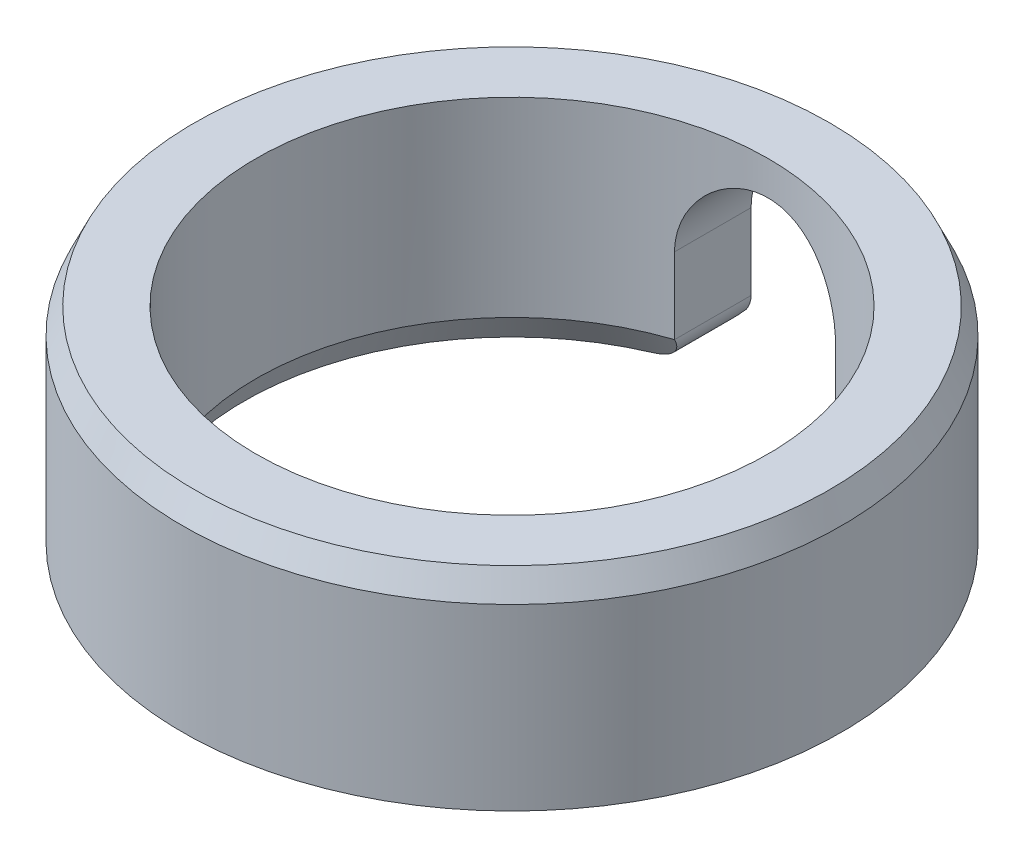
ISO-10303-21;
HEADER;
FILE_DESCRIPTION(('STEP AP214'),'2;1');
FILE_NAME('part.step','',(''),(''),'','','');
FILE_SCHEMA(('AUTOMOTIVE_DESIGN { 1 0 10303 214 1 1 1 1 }'));
ENDSEC;
DATA;
#1=APPLICATION_CONTEXT('core data for automotive mechanical design processes');
#2=APPLICATION_PROTOCOL_DEFINITION('international standard','automotive_design',2000,#1);
#3=PRODUCT_CONTEXT('',#1,'mechanical');
#4=PRODUCT('Part','Part','',(#3));
#5=PRODUCT_RELATED_PRODUCT_CATEGORY('part','',(#4));
#6=PRODUCT_DEFINITION_FORMATION('','',#4);
#7=PRODUCT_DEFINITION_CONTEXT('part definition',#1,'design');
#8=PRODUCT_DEFINITION('design','',#6,#7);
#9=PRODUCT_DEFINITION_SHAPE('','',#8);
#10=(LENGTH_UNIT() NAMED_UNIT(*) SI_UNIT(.MILLI.,.METRE.));
#11=(NAMED_UNIT(*) PLANE_ANGLE_UNIT() SI_UNIT($,.RADIAN.));
#12=(NAMED_UNIT(*) SI_UNIT($,.STERADIAN.) SOLID_ANGLE_UNIT());
#13=UNCERTAINTY_MEASURE_WITH_UNIT(LENGTH_MEASURE(1.E-05),#10,'distance_accuracy_value','');
#14=(GEOMETRIC_REPRESENTATION_CONTEXT(3) GLOBAL_UNCERTAINTY_ASSIGNED_CONTEXT((#13)) GLOBAL_UNIT_ASSIGNED_CONTEXT((#10,
#11,#12)) REPRESENTATION_CONTEXT('',''));
#15=CARTESIAN_POINT('',(0.,0.,0.));
#16=DIRECTION('',(0.,0.,1.));
#17=DIRECTION('',(1.,0.,0.));
#18=AXIS2_PLACEMENT_3D('',#15,#16,#17);
#19=CARTESIAN_POINT('',(0.,0.,0.));
#20=DIRECTION('',(0.,1.,0.));
#21=DIRECTION('',(0.,0.,-1.));
#22=AXIS2_PLACEMENT_3D('',#19,#20,#21);
#23=PLANE('',#22);
#24=CARTESIAN_POINT('',(0.,0.,0.));
#25=DIRECTION('',(0.,-1.,0.));
#26=DIRECTION('',(0.,0.,-1.));
#27=AXIS2_PLACEMENT_3D('',#24,#25,#26);
#28=CIRCLE('',#27,12.);
#29=CARTESIAN_POINT('',(-4.175,0.,-11.2503055514061));
#30=VERTEX_POINT('',#29);
#31=CARTESIAN_POINT('',(4.175,0.,-11.2503055514061));
#32=VERTEX_POINT('',#31);
#33=EDGE_CURVE('E203',#30,#32,#28,.F.);
#34=ORIENTED_EDGE('',*,*,#33,.F.);
#35=DIRECTION('',(0.,0.,1.));
#36=VECTOR('',#35,1.);
#37=CARTESIAN_POINT('',(-4.175,0.,-11.5723539092096));
#38=LINE('',#37,#36);
#39=CARTESIAN_POINT('',(-4.175,0.,-9.70650465032521));
#40=VERTEX_POINT('',#39);
#41=EDGE_CURVE('E205',#40,#30,#38,.F.);
#42=ORIENTED_EDGE('',*,*,#41,.F.);
#43=CARTESIAN_POINT('',(0.,0.,0.));
#44=DIRECTION('',(0.,-1.,0.));
#45=DIRECTION('',(0.,0.,-1.));
#46=AXIS2_PLACEMENT_3D('',#43,#44,#45);
#47=CIRCLE('',#46,10.566307658155);
#48=CARTESIAN_POINT('',(4.175,0.,-9.70650465032521));
#49=VERTEX_POINT('',#48);
#50=EDGE_CURVE('E208',#49,#40,#47,.T.);
#51=ORIENTED_EDGE('',*,*,#50,.F.);
#52=DIRECTION('',(0.,0.,1.));
#53=VECTOR('',#52,1.);
#54=CARTESIAN_POINT('',(4.175,0.,-10.0780073688594));
#55=LINE('',#54,#53);
#56=EDGE_CURVE('E207',#32,#49,#55,.T.);
#57=ORIENTED_EDGE('',*,*,#56,.F.);
#58=EDGE_LOOP('',(#34,#42,#51,#57));
#59=FACE_BOUND('',#58,.T.);
#60=ADVANCED_FACE('F39',(#59),#23,.F.);
#61=CARTESIAN_POINT('',(0.,8.5222,0.));
#62=DIRECTION('',(0.,-1.,0.));
#63=DIRECTION('',(0.,0.,1.));
#64=AXIS2_PLACEMENT_3D('',#61,#62,#63);
#65=CYLINDRICAL_SURFACE('',#64,13.);
#66=CARTESIAN_POINT('',(0.,7.52219999999998,0.));
#67=DIRECTION('',(0.,-1.,0.));
#68=DIRECTION('',(0.,0.,-1.));
#69=AXIS2_PLACEMENT_3D('',#66,#67,#68);
#70=CIRCLE('',#69,13.);
#71=CARTESIAN_POINT('',(0.,7.52219999999998,-13.));
#72=VERTEX_POINT('',#71);
#73=EDGE_CURVE('E220',#72,#72,#70,.F.);
#74=ORIENTED_EDGE('',*,*,#73,.F.);
#75=EDGE_LOOP('',(#74));
#76=FACE_BOUND('',#75,.T.);
#77=DIRECTION('',(0.,-1.,0.));
#78=VECTOR('',#77,1.);
#79=CARTESIAN_POINT('',(3.175,8.5222,-12.6063228183321));
#80=LINE('',#79,#78);
#81=CARTESIAN_POINT('',(3.175,1.,-12.6063228183321));
#82=VERTEX_POINT('',#81);
#83=CARTESIAN_POINT('',(3.175,4.,-12.6063228183321));
#84=VERTEX_POINT('',#83);
#85=EDGE_CURVE('E118',#82,#84,#80,.F.);
#86=ORIENTED_EDGE('',*,*,#85,.T.);
#87=CARTESIAN_POINT('',(3.175,4.,-12.6063228183321));
#88=CARTESIAN_POINT('',(3.17501009851098,4.08787378597044,-12.6063132651038));
#89=CARTESIAN_POINT('',(3.17135205246371,4.17574163314016,-12.6072414061624));
#90=CARTESIAN_POINT('',(3.15677809224827,4.35082163667164,-12.6109022385434));
#91=CARTESIAN_POINT('',(3.14586335778261,4.43803389728038,-12.6136346365515));
#92=CARTESIAN_POINT('',(3.11688221350419,4.61102183710995,-12.6208262840811));
#93=CARTESIAN_POINT('',(3.09882956040884,4.69679995081072,-12.6252822115338));
#94=CARTESIAN_POINT('',(3.05573924696344,4.86646035879583,-12.6357803710173));
#95=CARTESIAN_POINT('',(3.0307014992745,4.95034262936113,-12.6418226228829));
#96=CARTESIAN_POINT('',(2.94538203174719,5.19825788694416,-12.6620768224457));
#97=CARTESIAN_POINT('',(2.87486550593256,5.35872839791942,-12.6784237603703));
#98=CARTESIAN_POINT('',(2.70871790710507,5.66552296377543,-12.7149532550345));
#99=CARTESIAN_POINT('',(2.61308061908652,5.81184350560743,-12.7351367606187));
#100=CARTESIAN_POINT('',(2.39725547071148,6.08931557258449,-12.7775372544766));
#101=CARTESIAN_POINT('',(2.2766401517653,6.22013049083328,-12.7997853209167));
#102=CARTESIAN_POINT('',(2.01520014546072,6.45989161030491,-12.8435394802179));
#103=CARTESIAN_POINT('',(1.87437224902378,6.56883433235655,-12.8650454545859));
#104=CARTESIAN_POINT('',(1.57419315491871,6.76313546468767,-12.9052358723955));
#105=CARTESIAN_POINT('',(1.41462099510097,6.84816180457834,-12.9238790969982));
#106=CARTESIAN_POINT('',(1.08292663079487,6.99005332171802,-12.9558862783522));
#107=CARTESIAN_POINT('',(0.910806824940755,7.04692386517736,-12.9692512409886));
#108=CARTESIAN_POINT('',(0.562432144797513,7.12981307329099,-12.9889763366451));
#109=CARTESIAN_POINT('',(0.386321836070524,7.15640771066527,-12.9954670729382));
#110=CARTESIAN_POINT('',(0.0320237903202308,7.17979674776153,-13.001167073455));
#111=CARTESIAN_POINT('',(-0.146163696822422,7.17659469576418,-13.0003772046755));
#112=CARTESIAN_POINT('',(-0.495559824196341,7.14089726494223,-12.9917024330288));
#113=CARTESIAN_POINT('',(-0.66683633645111,7.10902408502989,-12.9839682372075));
#114=CARTESIAN_POINT('',(-1.00153097298404,7.01788790399895,-12.9624486739077));
#115=CARTESIAN_POINT('',(-1.16494875857107,6.95862372356376,-12.9486630458867));
#116=CARTESIAN_POINT('',(-1.48094705402903,6.81387467110486,-12.9163565307896));
#117=CARTESIAN_POINT('',(-1.63342041224417,6.72816524782373,-12.8977953267573));
#118=CARTESIAN_POINT('',(-1.92203607368809,6.53313014203601,-12.8579560541876));
#119=CARTESIAN_POINT('',(-2.05817604688336,6.42380109629582,-12.8366775989132));
#120=CARTESIAN_POINT('',(-2.3139591897748,6.18129971086971,-12.7930794362632));
#121=CARTESIAN_POINT('',(-2.43308733710246,6.04758592906107,-12.7707470254997));
#122=CARTESIAN_POINT('',(-2.64736905217607,5.76180547562919,-12.7280561405833));
#123=CARTESIAN_POINT('',(-2.74251606792799,5.60973380511136,-12.7076982068187));
#124=CARTESIAN_POINT('',(-2.90645104355116,5.29055437412133,-12.6712137286851));
#125=CARTESIAN_POINT('',(-2.97510532370128,5.12337547964163,-12.6551087699541));
#126=CARTESIAN_POINT('',(-3.08308837814951,4.77946170261939,-12.6292399245633));
#127=CARTESIAN_POINT('',(-3.12246093942907,4.60274151404603,-12.6194665726462));
#128=CARTESIAN_POINT('',(-3.15603300411806,4.3537543037499,-12.6110871362746));
#129=CARTESIAN_POINT('',(-3.16314703165299,4.28314345543998,-12.6093031675515));
#130=CARTESIAN_POINT('',(-3.17262509936245,4.14169952347456,-12.6069215996323));
#131=CARTESIAN_POINT('',(-3.17499687265751,4.07086699058227,-12.6063220690103));
#132=CARTESIAN_POINT('',(-3.175,4.,-12.6063228183321));
#133=B_SPLINE_CURVE_WITH_KNOTS('',3,(#87,#88,#89,#90,#91,#92,#93,#94,#95,#96,#97,#98,#99,#100,
#101,#102,#103,#104,#105,#106,#107,#108,#109,#110,#111,#112,#113,#114,#115,#116,#117,#118,#119,
#120,#121,#122,#123,#124,#125,#126,#127,#128,#129,#130,#131,#132),.UNSPECIFIED.,.F.,.F.,(4,2,2,
2,2,2,2,2,2,2,2,2,2,2,2,2,2,2,2,2,2,2,4),(0.,0.263530091183203,0.527017351380499,
0.789999255766269,1.05298444852231,1.57844638130477,2.10403843871948,2.63950435018495,
3.17505536988955,3.71771158457418,4.26026433461408,4.79231333969312,5.32429898756418,
5.84501121703347,6.36574586780086,6.8910298674039,7.41638871234221,7.95527466181701,
8.49430768356239,9.03602611501808,9.57693283955251,9.78977044600888,10.0022606974916),.UNSPECIFIED.);
#134=CARTESIAN_POINT('',(-3.175,4.,-12.6063228183321));
#135=VERTEX_POINT('',#134);
#136=EDGE_CURVE('E102',#84,#135,#133,.T.);
#137=ORIENTED_EDGE('',*,*,#136,.T.);
#138=DIRECTION('',(0.,-1.,0.));
#139=VECTOR('',#138,1.);
#140=CARTESIAN_POINT('',(-3.175,8.5222,-12.6063228183321));
#141=LINE('',#140,#139);
#142=CARTESIAN_POINT('',(-3.175,1.,-12.6063228183321));
#143=VERTEX_POINT('',#142);
#144=EDGE_CURVE('E110',#135,#143,#141,.T.);
#145=ORIENTED_EDGE('',*,*,#144,.T.);
#146=CARTESIAN_POINT('',(-3.32932128780724,0.466307658155002,-12.5664481760979));
#147=CARTESIAN_POINT('',(-3.3146339147258,0.489581659288447,-12.5703391937686));
#148=CARTESIAN_POINT('',(-3.30089432935479,0.513483028317116,-12.5739520155139));
#149=CARTESIAN_POINT('',(-3.27540392853389,0.562405435888356,-12.5806161824473));
#150=CARTESIAN_POINT('',(-3.26365356886449,0.587426729377128,-12.5836673989718));
#151=CARTESIAN_POINT('',(-3.23206671790876,0.662686016902155,-12.5918312691069));
#152=CARTESIAN_POINT('',(-3.2151587310711,0.714289331923373,-12.5961470879905));
#153=CARTESIAN_POINT('',(-3.19348463363715,0.804705918081518,-12.6016564351079));
#154=CARTESIAN_POINT('',(-3.18663700431524,0.843009026171563,-12.6033877929176));
#155=CARTESIAN_POINT('',(-3.17735131405145,0.920859328719894,-12.6057306401717));
#156=CARTESIAN_POINT('',(-3.17499236067866,0.960416567577988,-12.6063220415455));
#157=CARTESIAN_POINT('',(-3.175,1.,-12.6063228183321));
#158=B_SPLINE_CURVE_WITH_KNOTS('',3,(#146,#147,#148,#149,#150,#151,#152,#153,#154,#155,#156,
#157),.UNSPECIFIED.,.F.,.F.,(4,2,2,2,2,4),(0.,0.083329666978949,0.166678401066295,
0.329241375331635,0.44582986509137,0.564454717051472),.UNSPECIFIED.);
#159=CARTESIAN_POINT('',(-3.32932128780724,0.466307658155002,-12.5664481760979));
#160=VERTEX_POINT('',#159);
#161=EDGE_CURVE('E147',#160,#143,#158,.T.);
#162=ORIENTED_EDGE('',*,*,#161,.F.);
#163=CARTESIAN_POINT('',(0.,0.466307658155002,0.));
#164=DIRECTION('',(0.,-1.,0.));
#165=DIRECTION('',(0.,0.,-1.));
#166=AXIS2_PLACEMENT_3D('',#163,#164,#165);
#167=CIRCLE('',#166,13.);
#168=CARTESIAN_POINT('',(3.32932128780724,0.466307658155002,-12.5664481760979));
#169=VERTEX_POINT('',#168);
#170=EDGE_CURVE('E223',#169,#160,#167,.T.);
#171=ORIENTED_EDGE('',*,*,#170,.F.);
#172=CARTESIAN_POINT('',(3.175,1.,-12.6063228183321));
#173=CARTESIAN_POINT('',(3.17500023984745,0.972207944779752,-12.6063221924203));
#174=CARTESIAN_POINT('',(3.17615952654659,0.944431586658988,-12.6060308357941));
#175=CARTESIAN_POINT('',(3.18078206207391,0.889080668877479,-12.604865491831));
#176=CARTESIAN_POINT('',(3.18424555028913,0.861506130485058,-12.6039914439573));
#177=CARTESIAN_POINT('',(3.19784301795716,0.78070290364726,-12.6005512176184));
#178=CARTESIAN_POINT('',(3.21118821717571,0.728004388055886,-12.5971663252682));
#179=CARTESIAN_POINT('',(3.24117892568194,0.64015772501383,-12.5894766939692));
#180=CARTESIAN_POINT('',(3.25582690792811,0.604257448940297,-12.5857019888294));
#181=CARTESIAN_POINT('',(3.28939991579291,0.533887391529717,-12.5769688879727));
#182=CARTESIAN_POINT('',(3.30839504268942,0.499453452204882,-12.5719910065933));
#183=CARTESIAN_POINT('',(3.32932128780724,0.466307658155002,-12.5664481760979));
#184=B_SPLINE_CURVE_WITH_KNOTS('',3,(#172,#173,#174,#175,#176,#177,#178,#179,#180,#181,#182,
#183),.UNSPECIFIED.,.F.,.F.,(4,2,2,2,2,4),(0.,0.0833193461441916,0.166647349815072,
0.329185528440588,0.445804285504046,0.564455786169551),.UNSPECIFIED.);
#185=EDGE_CURVE('E153',#82,#169,#184,.T.);
#186=ORIENTED_EDGE('',*,*,#185,.F.);
#187=EDGE_LOOP('',(#86,#137,#145,#162,#171,#186));
#188=FACE_BOUND('',#187,.T.);
#189=ADVANCED_FACE('F115',(#76,#188),#65,.T.);
#190=CARTESIAN_POINT('',(0.,8.5222,0.));
#191=DIRECTION('',(0.,-1.,0.));
#192=DIRECTION('',(0.,0.,1.));
#193=AXIS2_PLACEMENT_3D('',#190,#191,#192);
#194=CYLINDRICAL_SURFACE('',#193,10.1);
#195=CARTESIAN_POINT('',(0.,8.5222,0.));
#196=DIRECTION('',(0.,-1.,0.));
#197=DIRECTION('',(0.,0.,-1.));
#198=AXIS2_PLACEMENT_3D('',#195,#196,#197);
#199=CIRCLE('',#198,10.1);
#200=CARTESIAN_POINT('',(0.,8.5222,-10.1));
#201=VERTEX_POINT('',#200);
#202=EDGE_CURVE('E120',#201,#201,#199,.T.);
#203=ORIENTED_EDGE('',*,*,#202,.F.);
#204=EDGE_LOOP('',(#203));
#205=FACE_BOUND('',#204,.T.);
#206=DIRECTION('',(0.,-1.,0.));
#207=VECTOR('',#206,1.);
#208=CARTESIAN_POINT('',(-3.175,8.5222,-9.58798075717719));
#209=LINE('',#208,#207);
#210=CARTESIAN_POINT('',(-3.175,4.,-9.58798075717719));
#211=VERTEX_POINT('',#210);
#212=CARTESIAN_POINT('',(-3.175,1.00000000000001,-9.58798075717719));
#213=VERTEX_POINT('',#212);
#214=EDGE_CURVE('E241',#211,#213,#209,.T.);
#215=ORIENTED_EDGE('',*,*,#214,.F.);
#216=CARTESIAN_POINT('',(3.175,4.,-9.58798075717719));
#217=CARTESIAN_POINT('',(3.17501110403846,4.08692347838906,-9.58796790786724));
#218=CARTESIAN_POINT('',(3.17143060657522,4.17383967538083,-9.58916251621892));
#219=CARTESIAN_POINT('',(3.15717284476817,4.34700422154223,-9.5938710908655));
#220=CARTESIAN_POINT('',(3.14649730839338,4.43325272815239,-9.59738449242591));
#221=CARTESIAN_POINT('',(3.11817420570668,4.60423985769642,-9.6066226645862));
#222=CARTESIAN_POINT('',(3.10054558646608,4.68898193521027,-9.61234142467388));
#223=CARTESIAN_POINT('',(3.05849249682685,4.8565761805437,-9.62580427323813));
#224=CARTESIAN_POINT('',(3.03406782069659,4.93942829106765,-9.63354842302729));
#225=CARTESIAN_POINT('',(2.95090981681227,5.18422100488252,-9.65947949565651));
#226=CARTESIAN_POINT('',(2.88225359091744,5.3426302969105,-9.68037855294418));
#227=CARTESIAN_POINT('',(2.72064109945418,5.64569216879029,-9.72703165664799));
#228=CARTESIAN_POINT('',(2.62767200972875,5.79033743353579,-9.75278826324065));
#229=CARTESIAN_POINT('',(2.4166165716316,6.06682215665654,-9.80725167648352));
#230=CARTESIAN_POINT('',(2.29783454248537,6.19811841550925,-9.83602563189224));
#231=CARTESIAN_POINT('',(2.04001349194838,6.43929190011796,-9.89271164234553));
#232=CARTESIAN_POINT('',(1.900970982496,6.54916543008779,-9.92062354797402));
#233=CARTESIAN_POINT('',(1.60263746566888,6.74679940664522,-9.97321313387937));
#234=CARTESIAN_POINT('',(1.44295542775338,6.83399534559063,-9.99780203011461));
#235=CARTESIAN_POINT('',(1.11029445485004,6.98007509157532,-10.0401847718689));
#236=CARTESIAN_POINT('',(0.937319227682667,7.03896676041487,-10.0579805039758));
#237=CARTESIAN_POINT('',(0.588704828610891,7.12494295664201,-10.0842954772797));
#238=CARTESIAN_POINT('',(0.41331721675818,7.1529626730543,-10.0930868607303));
#239=CARTESIAN_POINT('',(0.0601209450263003,7.17936362250599,-10.101364266219));
#240=CARTESIAN_POINT('',(-0.117687199257961,7.17775107174336,-10.1008522399082));
#241=CARTESIAN_POINT('',(-0.464085359933637,7.14554536770283,-10.0907691973101));
#242=CARTESIAN_POINT('',(-0.63278040055622,7.11596665944189,-10.0815152941289));
#243=CARTESIAN_POINT('',(-0.962675979439209,7.03033458117567,-10.0553791770672));
#244=CARTESIAN_POINT('',(-1.12387611290808,6.97427978304667,-10.0384965516945));
#245=CARTESIAN_POINT('',(-1.43653957134369,6.83663891109923,-9.99857598515466));
#246=CARTESIAN_POINT('',(-1.58785826282529,6.75474643258653,-9.97546468564356));
#247=CARTESIAN_POINT('',(-1.8749181551735,6.5680046876658,-9.92551969960479));
#248=CARTESIAN_POINT('',(-2.01065552623607,6.46314979555823,-9.89868510147521));
#249=CARTESIAN_POINT('',(-2.26873919353474,6.22826058277902,-9.84281463940079));
#250=CARTESIAN_POINT('',(-2.39028220563004,6.09735275424085,-9.81373366163234));
#251=CARTESIAN_POINT('',(-2.60994860345359,5.81674891470858,-9.75761508849663));
#252=CARTESIAN_POINT('',(-2.70806489398501,5.66704723255653,-9.73057811388186));
#253=CARTESIAN_POINT('',(-2.87908914208688,5.35060294375097,-9.68136955450722));
#254=CARTESIAN_POINT('',(-2.95168204929347,5.18367817378625,-9.65925993200412));
#255=CARTESIAN_POINT('',(-3.03846181932092,4.92555211717256,-9.63216694333008));
#256=CARTESIAN_POINT('',(-3.06370112936791,4.83823536851029,-9.62414867935728));
#257=CARTESIAN_POINT('',(-3.10663023235459,4.66160158960844,-9.6103778519474));
#258=CARTESIAN_POINT('',(-3.12432349221659,4.57228549783227,-9.60462424813925));
#259=CARTESIAN_POINT('',(-3.15040966796892,4.40256320321831,-9.59609773866992));
#260=CARTESIAN_POINT('',(-3.15962996628368,4.3222957234519,-9.59306073111703));
#261=CARTESIAN_POINT('',(-3.17192450252452,4.16135496600783,-9.58899906712817));
#262=CARTESIAN_POINT('',(-3.17500736109734,4.08068241730107,-9.58797158814452));
#263=CARTESIAN_POINT('',(-3.175,4.,-9.58798075717719));
#264=B_SPLINE_CURVE_WITH_KNOTS('',3,(#216,#217,#218,#219,#220,#221,#222,#223,#224,#225,#226,
#227,#228,#229,#230,#231,#232,#233,#234,#235,#236,#237,#238,#239,#240,#241,#242,#243,#244,#245,
#246,#247,#248,#249,#250,#251,#252,#253,#254,#255,#256,#257,#258,#259,#260,#261,#262,#263),
.UNSPECIFIED.,.F.,.F.,(4,2,2,2,2,2,2,2,2,2,2,2,2,2,2,2,2,2,2,2,2,2,2,4),(0.,0.260676156874212,
0.521288850341595,0.781196229940401,1.04111147836541,1.56024307553596,2.07964905009505,
2.61532835383672,3.15109998978589,3.69915064935121,4.24704899414307,4.77785030629928,
5.30854026928509,5.82068985563875,6.33286707056274,6.85136210322621,7.36998430749708,
7.91041830266016,8.45101577077696,8.99806944537035,9.27150581261408,9.5448164178363,
9.787120626554,10.0290842540233),.UNSPECIFIED.);
#265=CARTESIAN_POINT('',(3.175,4.,-9.58798075717719));
#266=VERTEX_POINT('',#265);
#267=EDGE_CURVE('E105',#266,#211,#264,.T.);
#268=ORIENTED_EDGE('',*,*,#267,.F.);
#269=DIRECTION('',(0.,-1.,0.));
#270=VECTOR('',#269,1.);
#271=CARTESIAN_POINT('',(3.175,8.5222,-9.58798075717719));
#272=LINE('',#271,#270);
#273=CARTESIAN_POINT('',(3.175,1.00000000000001,-9.58798075717719));
#274=VERTEX_POINT('',#273);
#275=EDGE_CURVE('E209',#274,#266,#272,.F.);
#276=ORIENTED_EDGE('',*,*,#275,.F.);
#277=CARTESIAN_POINT('',(0.,1.00000000000001,0.));
#278=DIRECTION('',(0.,-1.,0.));
#279=DIRECTION('',(0.,0.,-1.));
#280=AXIS2_PLACEMENT_3D('',#277,#278,#279);
#281=CIRCLE('',#280,10.1);
#282=EDGE_CURVE('E212',#213,#274,#281,.F.);
#283=ORIENTED_EDGE('',*,*,#282,.F.);
#284=EDGE_LOOP('',(#215,#268,#276,#283));
#285=FACE_BOUND('',#284,.T.);
#286=ADVANCED_FACE('F137',(#205,#285),#194,.F.);
#287=CARTESIAN_POINT('',(0.,8.5222,0.));
#288=DIRECTION('',(0.,1.,0.));
#289=DIRECTION('',(0.,0.,-1.));
#290=AXIS2_PLACEMENT_3D('',#287,#288,#289);
#291=PLANE('',#290);
#292=CARTESIAN_POINT('',(0.,8.5222,0.));
#293=DIRECTION('',(0.,-1.,0.));
#294=DIRECTION('',(0.,0.,-1.));
#295=AXIS2_PLACEMENT_3D('',#292,#293,#294);
#296=CIRCLE('',#295,12.533692341845);
#297=CARTESIAN_POINT('',(0.,8.5222,-12.533692341845));
#298=VERTEX_POINT('',#297);
#299=EDGE_CURVE('E225',#298,#298,#296,.T.);
#300=ORIENTED_EDGE('',*,*,#299,.F.);
#301=EDGE_LOOP('',(#300));
#302=FACE_BOUND('',#301,.T.);
#303=ORIENTED_EDGE('',*,*,#202,.T.);
#304=EDGE_LOOP('',(#303));
#305=FACE_BOUND('',#304,.T.);
#306=ADVANCED_FACE('F250',(#302,#305),#291,.T.);
#307=CARTESIAN_POINT('',(3.175,0.,-13.));
#308=DIRECTION('',(-1.,0.,0.));
#309=DIRECTION('',(0.,-1.,0.));
#310=AXIS2_PLACEMENT_3D('',#307,#308,#309);
#311=PLANE('',#310);
#312=ORIENTED_EDGE('',*,*,#275,.T.);
#313=DIRECTION('',(0.,0.,1.));
#314=VECTOR('',#313,1.);
#315=CARTESIAN_POINT('',(3.175,4.,-13.));
#316=LINE('',#315,#314);
#317=EDGE_CURVE('E107',#84,#266,#316,.T.);
#318=ORIENTED_EDGE('',*,*,#317,.F.);
#319=ORIENTED_EDGE('',*,*,#85,.F.);
#320=DIRECTION('',(0.,0.,1.));
#321=VECTOR('',#320,1.);
#322=CARTESIAN_POINT('',(3.175,1.,-11.5723539092096));
#323=LINE('',#322,#321);
#324=EDGE_CURVE('E154',#274,#82,#323,.F.);
#325=ORIENTED_EDGE('',*,*,#324,.F.);
#326=EDGE_LOOP('',(#312,#318,#319,#325));
#327=FACE_BOUND('',#326,.T.);
#328=ADVANCED_FACE('F237',(#327),#311,.T.);
#329=CARTESIAN_POINT('',(0.,4.,-13.));
#330=DIRECTION('',(0.,0.,1.));
#331=DIRECTION('',(-1.,0.,0.));
#332=AXIS2_PLACEMENT_3D('',#329,#330,#331);
#333=CYLINDRICAL_SURFACE('',#332,3.175);
#334=ORIENTED_EDGE('',*,*,#136,.F.);
#335=ORIENTED_EDGE('',*,*,#317,.T.);
#336=ORIENTED_EDGE('',*,*,#267,.T.);
#337=DIRECTION('',(0.,0.,1.));
#338=VECTOR('',#337,1.);
#339=CARTESIAN_POINT('',(-3.175,4.,-13.));
#340=LINE('',#339,#338);
#341=EDGE_CURVE('E99',#135,#211,#340,.T.);
#342=ORIENTED_EDGE('',*,*,#341,.F.);
#343=EDGE_LOOP('',(#334,#335,#336,#342));
#344=FACE_BOUND('',#343,.T.);
#345=ADVANCED_FACE('F100',(#344),#333,.F.);
#346=CARTESIAN_POINT('',(-3.175,4.,-13.));
#347=DIRECTION('',(1.,0.,0.));
#348=DIRECTION('',(0.,1.,0.));
#349=AXIS2_PLACEMENT_3D('',#346,#347,#348);
#350=PLANE('',#349);
#351=ORIENTED_EDGE('',*,*,#144,.F.);
#352=ORIENTED_EDGE('',*,*,#341,.T.);
#353=ORIENTED_EDGE('',*,*,#214,.T.);
#354=DIRECTION('',(0.,0.,1.));
#355=VECTOR('',#354,1.);
#356=CARTESIAN_POINT('',(-3.175,1.,-10.0780073688594));
#357=LINE('',#356,#355);
#358=EDGE_CURVE('E11',#143,#213,#357,.T.);
#359=ORIENTED_EDGE('',*,*,#358,.F.);
#360=EDGE_LOOP('',(#351,#352,#353,#359));
#361=FACE_BOUND('',#360,.T.);
#362=ADVANCED_FACE('F111',(#361),#350,.T.);
#363=CARTESIAN_POINT('',(0.,0.,0.));
#364=DIRECTION('',(0.,-1.,0.));
#365=DIRECTION('',(0.,0.,1.));
#366=AXIS2_PLACEMENT_3D('',#363,#364,#365);
#367=CONICAL_SURFACE('',#366,10.566307658155,0.436332312998579);
#368=ORIENTED_EDGE('',*,*,#50,.T.);
#369=CARTESIAN_POINT('',(-3.175,1.,-9.58798075717719));
#370=CARTESIAN_POINT('',(-3.17496854698984,0.946239218684941,-9.61438309462444));
#371=CARTESIAN_POINT('',(-3.1793384511909,0.891803868981645,-9.63967909242346));
#372=CARTESIAN_POINT('',(-3.19732102050281,0.78273168016029,-9.6873128488399));
#373=CARTESIAN_POINT('',(-3.21099665885834,0.72809600711515,-9.70962920500981));
#374=CARTESIAN_POINT('',(-3.24811952427756,0.62032249203401,-9.75025691689929));
#375=CARTESIAN_POINT('',(-3.27160740326202,0.567191874783772,-9.7685511219928));
#376=CARTESIAN_POINT('',(-3.32826587940373,0.464791316171876,-9.79983492347963));
#377=CARTESIAN_POINT('',(-3.36140869558973,0.415510805450993,-9.81283948646986));
#378=CARTESIAN_POINT('',(-3.43241770967107,0.328157609247358,-9.83136983482095));
#379=CARTESIAN_POINT('',(-3.46932061485449,0.289447679071895,-9.83757702020648));
#380=CARTESIAN_POINT('',(-3.54913391135357,0.218243149476815,-9.84436638654558));
#381=CARTESIAN_POINT('',(-3.5920388921836,0.185743014068,-9.84495360081161));
#382=CARTESIAN_POINT('',(-3.67716285219476,0.131428865295951,-9.84049840817687));
#383=CARTESIAN_POINT('',(-3.7189135263868,0.108823069750396,-9.83608341023625));
#384=CARTESIAN_POINT('',(-3.80462255656868,0.0699253275393456,-9.82270347155137));
#385=CARTESIAN_POINT('',(-3.84858371908966,0.05364164864783,-9.81373260798369));
#386=CARTESIAN_POINT('',(-3.93999891454142,0.0267703831713041,-9.79091007179516));
#387=CARTESIAN_POINT('',(-3.98750515379441,0.0165793007179311,-9.77679978093443));
#388=CARTESIAN_POINT('',(-4.05833595730351,0.00654133216267081,-9.75258635341864));
#389=CARTESIAN_POINT('',(-4.08186028388463,0.00407002726975992,-9.74401349726912));
#390=CARTESIAN_POINT('',(-4.12864869179017,0.000800338802658234,-9.7259374406508));
#391=CARTESIAN_POINT('',(-4.15191294388662,7.84459773478916E-07,-9.71643489615133));
#392=CARTESIAN_POINT('',(-4.175,0.,-9.70650465032521));
#393=B_SPLINE_CURVE_WITH_KNOTS('',3,(#369,#370,#371,#372,#373,#374,#375,#376,#377,#378,#379,
#380,#381,#382,#383,#384,#385,#386,#387,#388,#389,#390,#391,#392),.UNSPECIFIED.,.F.,.F.,(4,2,2,
2,2,2,2,2,2,2,2,4),(0.,0.179690079972282,0.360608402763578,0.542283818906912,0.72344156293585,
0.884034429324942,1.04448345337386,1.18683793383166,1.32937795687339,1.48039796004169,
1.55581409756825,1.63117740157397),.UNSPECIFIED.);
#394=EDGE_CURVE('E229',#213,#40,#393,.T.);
#395=ORIENTED_EDGE('',*,*,#394,.F.);
#396=ORIENTED_EDGE('',*,*,#282,.T.);
#397=CARTESIAN_POINT('',(4.175,0.,-9.70650465032521));
#398=CARTESIAN_POINT('',(4.15178650335925,6.74065175684977E-07,-9.71648936557001));
#399=CARTESIAN_POINT('',(4.12839339644712,0.000809098266087378,-9.72604173493708));
#400=CARTESIAN_POINT('',(4.08134610284464,0.0041152155076517,-9.7442063733783));
#401=CARTESIAN_POINT('',(4.05769175296476,0.00661403094162862,-9.75281801340739));
#402=CARTESIAN_POINT('',(3.98642411751239,0.016770560036007,-9.7771459331305));
#403=CARTESIAN_POINT('',(3.93861197351461,0.0270890326182697,-9.79130942870474));
#404=CARTESIAN_POINT('',(3.8437702338645,0.0551492285800891,-9.81487905605967));
#405=CARTESIAN_POINT('',(3.79674461617234,0.0729209998354879,-9.82426558665674));
#406=CARTESIAN_POINT('',(3.70538803050179,0.11569252051026,-9.83777558167108));
#407=CARTESIAN_POINT('',(3.66105165475648,0.140677140300506,-9.84190996592492));
#408=CARTESIAN_POINT('',(3.57944877465298,0.195284977406764,-9.84478070941037));
#409=CARTESIAN_POINT('',(3.54190703278643,0.224481040192056,-9.8438627267201));
#410=CARTESIAN_POINT('',(3.47152555877191,0.287705946175027,-9.83764502968649));
#411=CARTESIAN_POINT('',(3.43868876100391,0.321737779223979,-9.83234259468396));
#412=CARTESIAN_POINT('',(3.37854085874323,0.393499611575259,-9.81779018596452));
#413=CARTESIAN_POINT('',(3.35122065900662,0.431223368941401,-9.80854678934698));
#414=CARTESIAN_POINT('',(3.30242848444132,0.509345759311835,-9.78664259478797));
#415=CARTESIAN_POINT('',(3.28095753545487,0.549744859975724,-9.7739811981715));
#416=CARTESIAN_POINT('',(3.24224113145156,0.636120465161515,-9.74445495039217));
#417=CARTESIAN_POINT('',(3.22558689300589,0.682263218911122,-9.7273059058396));
#418=CARTESIAN_POINT('',(3.19934277947981,0.775423002805641,-9.69023220561571));
#419=CARTESIAN_POINT('',(3.18975323224581,0.822440073420603,-9.67030742118351));
#420=CARTESIAN_POINT('',(3.18068478798804,0.891255148014203,-9.63950861709297));
#421=CARTESIAN_POINT('',(3.17854129311755,0.913118275408916,-9.62948054734197));
#422=CARTESIAN_POINT('',(3.17570112851092,0.956683049558224,-9.60902458956578));
#423=CARTESIAN_POINT('',(3.17500075976591,0.978384966737057,-9.59859779368153));
#424=CARTESIAN_POINT('',(3.17499999999875,1.00000000000004,-9.58798075717765));
#425=B_SPLINE_CURVE_WITH_KNOTS('',3,(#397,#398,#399,#400,#401,#402,#403,#404,#405,#406,#407,
#408,#409,#410,#411,#412,#413,#414,#415,#416,#417,#418,#419,#420,#421,#422,#423,#424),
.UNSPECIFIED.,.F.,.F.,(4,2,2,2,2,2,2,2,2,2,2,2,2,4),(0.,0.0757767317263039,0.151603827466221,
0.303599802266566,0.456214528456105,0.608511428378114,0.750524238364796,0.892625236939688,
1.0344900047593,1.17637963684383,1.33168069014493,1.48698894994454,1.55939580269516,
1.63161683076212),.UNSPECIFIED.);
#426=EDGE_CURVE('E174',#49,#274,#425,.T.);
#427=ORIENTED_EDGE('',*,*,#426,.F.);
#428=EDGE_LOOP('',(#368,#395,#396,#427));
#429=FACE_BOUND('',#428,.T.);
#430=ADVANCED_FACE('F140',(#429),#367,.F.);
#431=CARTESIAN_POINT('',(0.,0.466307658155002,0.));
#432=DIRECTION('',(0.,1.,0.));
#433=DIRECTION('',(0.,0.,-1.));
#434=AXIS2_PLACEMENT_3D('',#431,#432,#433);
#435=CONICAL_SURFACE('',#434,13.,1.13446401379632);
#436=ORIENTED_EDGE('',*,*,#170,.T.);
#437=CARTESIAN_POINT('',(-4.175,0.,-11.2503055514061));
#438=CARTESIAN_POINT('',(-4.1381019602181,3.14930727840047E-05,-11.2640750754621));
#439=CARTESIAN_POINT('',(-4.10300253213801,0.00203692741588171,-11.2814765985873));
#440=CARTESIAN_POINT('',(-4.03678970255124,0.00904060271170865,-11.3212804973148));
#441=CARTESIAN_POINT('',(-4.00562169052088,0.013990637895328,-11.3435987544555));
#442=CARTESIAN_POINT('',(-3.9286517992872,0.0296068492048749,-11.406001238739));
#443=CARTESIAN_POINT('',(-3.88537077825589,0.0419198459016296,-11.4486783966369));
#444=CARTESIAN_POINT('',(-3.80497842882904,0.069996245042098,-11.5390653723912));
#445=CARTESIAN_POINT('',(-3.76793575391717,0.0857941128911328,-11.5868228009845));
#446=CARTESIAN_POINT('',(-3.69714788552218,0.120626363774732,-11.6879845469346));
#447=CARTESIAN_POINT('',(-3.66371153109178,0.139794002143313,-11.7415555871228));
#448=CARTESIAN_POINT('',(-3.6015476428225,0.179927052163448,-11.8507531065855));
#449=CARTESIAN_POINT('',(-3.57282526351999,0.200894394076281,-11.9063817554218));
#450=CARTESIAN_POINT('',(-3.51939400114011,0.244117622080119,-12.0188994123378));
#451=CARTESIAN_POINT('',(-3.49467843490706,0.266371276761666,-12.0757861380439));
#452=CARTESIAN_POINT('',(-3.44865739477402,0.31190585540901,-12.1905219956524));
#453=CARTESIAN_POINT('',(-3.42735252232481,0.335186959636629,-12.2483712953165));
#454=CARTESIAN_POINT('',(-3.39292074454787,0.376402871889829,-12.349618572553));
#455=CARTESIAN_POINT('',(-3.379108117801,0.394153120736451,-12.3928614463057));
#456=CARTESIAN_POINT('',(-3.35307006299724,0.429984395411656,-12.4795140312484));
#457=CARTESIAN_POINT('',(-3.34083972489885,0.448064189153156,-12.5229227738902));
#458=CARTESIAN_POINT('',(-3.32932128780729,0.466307658154841,-12.566448176098));
#459=B_SPLINE_CURVE_WITH_KNOTS('',3,(#437,#438,#439,#440,#441,#442,#443,#444,#445,#446,#447,
#448,#449,#450,#451,#452,#453,#454,#455,#456,#457,#458),.UNSPECIFIED.,.F.,.F.,(4,2,2,2,2,2,2,2,
2,2,4),(0.,0.117297029504803,0.232724694179129,0.417816094021977,0.604827401433842,
0.802511552375677,1.00041044298283,1.19797577473201,1.39557590738996,1.54177681854196,
1.68751257399205),.UNSPECIFIED.);
#460=EDGE_CURVE('E60',#30,#160,#459,.T.);
#461=ORIENTED_EDGE('',*,*,#460,.F.);
#462=ORIENTED_EDGE('',*,*,#33,.T.);
#463=CARTESIAN_POINT('',(3.32932128780724,0.466307658155002,-12.5664481760979));
#464=CARTESIAN_POINT('',(3.33917542926672,0.450696082173974,-12.5292029929744));
#465=CARTESIAN_POINT('',(3.34955286052906,0.435206442715172,-12.4920468850187));
#466=CARTESIAN_POINT('',(3.37142330036725,0.404499916803823,-12.4179409659725));
#467=CARTESIAN_POINT('',(3.38291655547084,0.389283091510038,-12.380991202387));
#468=CARTESIAN_POINT('',(3.41930215677405,0.343926657471055,-12.2701056395651));
#469=CARTESIAN_POINT('',(3.44599143886199,0.314256848757273,-12.1965519383351));
#470=CARTESIAN_POINT('',(3.50557432545084,0.255924048074611,-12.0493384223677));
#471=CARTESIAN_POINT('',(3.53859598742814,0.227299659302695,-11.9757147333084));
#472=CARTESIAN_POINT('',(3.61160760229229,0.172547683448718,-11.8311891295564));
#473=CARTESIAN_POINT('',(3.65157895027005,0.146413711380511,-11.7602805495392));
#474=CARTESIAN_POINT('',(3.72505407685945,0.106338085422846,-11.646917378388));
#475=CARTESIAN_POINT('',(3.75595219880033,0.0913228453573286,-11.6031634760947));
#476=CARTESIAN_POINT('',(3.8224511807321,0.0635108632341479,-11.518602636011));
#477=CARTESIAN_POINT('',(3.85804561649561,0.0507111448241672,-11.4777917882016));
#478=CARTESIAN_POINT('',(3.92492713382381,0.0313231479612791,-11.4110866919087));
#479=CARTESIAN_POINT('',(3.95488638866364,0.0239865550682303,-11.3840916007743));
#480=CARTESIAN_POINT('',(4.01836353341973,0.0118190976261604,-11.3341584285354));
#481=CARTESIAN_POINT('',(4.05186137123609,0.00697493992120313,-11.3111992637536));
#482=CARTESIAN_POINT('',(4.10125326797481,0.00262389058032284,-11.2833972638559));
#483=CARTESIAN_POINT('',(4.11557968288728,0.00166006463779399,-11.2759795359609));
#484=CARTESIAN_POINT('',(4.14484703129648,0.000346783921397324,-11.2622534618025));
#485=CARTESIAN_POINT('',(4.159790132962,-2.73185046538625E-07,-11.2559495304785));
#486=CARTESIAN_POINT('',(4.175,0.,-11.2503055514061));
#487=B_SPLINE_CURVE_WITH_KNOTS('',3,(#463,#464,#465,#466,#467,#468,#469,#470,#471,#472,#473,
#474,#475,#476,#477,#478,#479,#480,#481,#482,#483,#484,#485,#486),.UNSPECIFIED.,.F.,.F.,(4,2,2,
2,2,2,2,2,2,2,2,4),(0.,0.124700800907865,0.249429215914391,0.500284008799411,0.75688209850166,
1.01280354259902,1.1794766400917,1.34592405963169,1.46861163782853,1.59063790856264,
1.63906838235818,1.68768671946608),.UNSPECIFIED.);
#488=EDGE_CURVE('E48',#169,#32,#487,.T.);
#489=ORIENTED_EDGE('',*,*,#488,.F.);
#490=EDGE_LOOP('',(#436,#461,#462,#489));
#491=FACE_BOUND('',#490,.T.);
#492=ADVANCED_FACE('F184',(#491),#435,.T.);
#493=CARTESIAN_POINT('',(0.,8.5222,0.));
#494=DIRECTION('',(0.,-1.,0.));
#495=DIRECTION('',(0.,0.,1.));
#496=AXIS2_PLACEMENT_3D('',#493,#494,#495);
#497=CONICAL_SURFACE('',#496,12.533692341845,0.436332312998581);
#498=ORIENTED_EDGE('',*,*,#73,.T.);
#499=EDGE_LOOP('',(#498));
#500=FACE_BOUND('',#499,.T.);
#501=ORIENTED_EDGE('',*,*,#299,.T.);
#502=EDGE_LOOP('',(#501));
#503=FACE_BOUND('',#502,.T.);
#504=ADVANCED_FACE('F170',(#500,#503),#497,.T.);
#505=CARTESIAN_POINT('',(4.175,1.,0.));
#506=DIRECTION('',(0.,0.,-1.));
#507=DIRECTION('',(1.,0.,0.));
#508=AXIS2_PLACEMENT_3D('',#505,#506,#507);
#509=CYLINDRICAL_SURFACE('',#508,1.);
#510=ORIENTED_EDGE('',*,*,#185,.T.);
#511=ORIENTED_EDGE('',*,*,#488,.T.);
#512=ORIENTED_EDGE('',*,*,#56,.T.);
#513=ORIENTED_EDGE('',*,*,#426,.T.);
#514=ORIENTED_EDGE('',*,*,#324,.T.);
#515=EDGE_LOOP('',(#510,#511,#512,#513,#514));
#516=FACE_BOUND('',#515,.T.);
#517=ADVANCED_FACE('F166',(#516),#509,.T.);
#518=CARTESIAN_POINT('',(-4.175,1.,-13.));
#519=DIRECTION('',(0.,0.,-1.));
#520=DIRECTION('',(1.,0.,0.));
#521=AXIS2_PLACEMENT_3D('',#518,#519,#520);
#522=CYLINDRICAL_SURFACE('',#521,1.);
#523=ORIENTED_EDGE('',*,*,#460,.T.);
#524=ORIENTED_EDGE('',*,*,#161,.T.);
#525=ORIENTED_EDGE('',*,*,#358,.T.);
#526=ORIENTED_EDGE('',*,*,#394,.T.);
#527=ORIENTED_EDGE('',*,*,#41,.T.);
#528=EDGE_LOOP('',(#523,#524,#525,#526,#527));
#529=FACE_BOUND('',#528,.T.);
#530=ADVANCED_FACE('F41',(#529),#522,.T.);
#531=CLOSED_SHELL('',(#60,#189,#286,#306,#328,#345,#362,#430,#492,#504,#517,#530));
#532=MANIFOLD_SOLID_BREP('B2',#531);
#533=ADVANCED_BREP_SHAPE_REPRESENTATION('',(#18,#532),#14);
#534=SHAPE_DEFINITION_REPRESENTATION(#9,#533);
ENDSEC;
END-ISO-10303-21;
